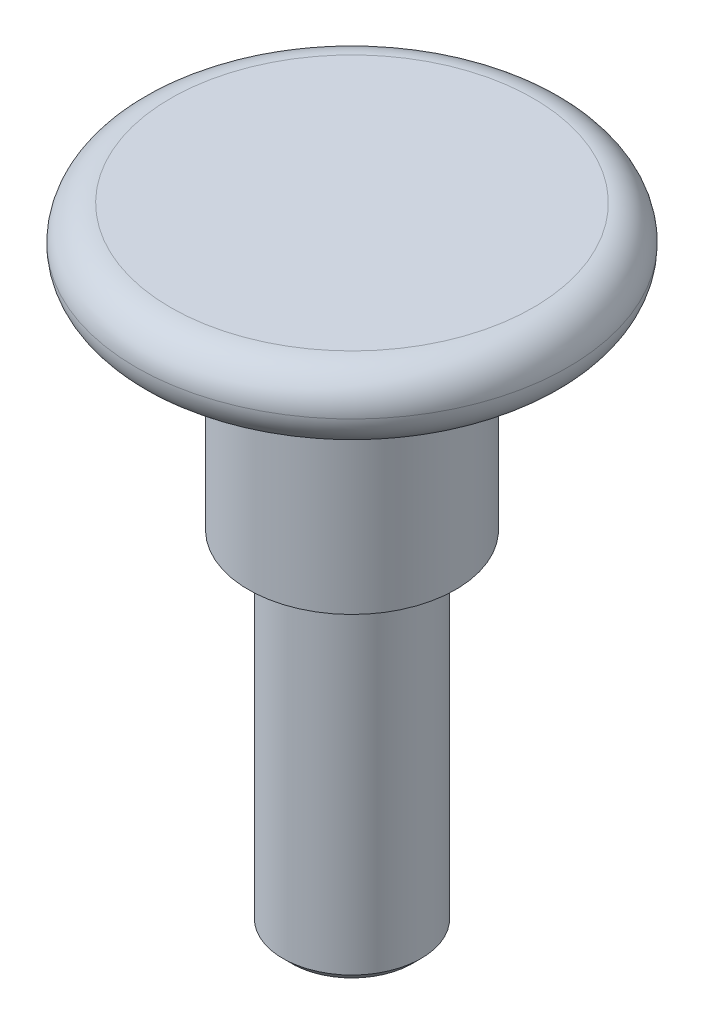
ISO-10303-21;
HEADER;
FILE_DESCRIPTION(('STEP AP214'),'2;1');
FILE_NAME('part.step','',(''),(''),'','','');
FILE_SCHEMA(('AUTOMOTIVE_DESIGN { 1 0 10303 214 1 1 1 1 }'));
ENDSEC;
DATA;
#1=APPLICATION_CONTEXT('core data for automotive mechanical design processes');
#2=APPLICATION_PROTOCOL_DEFINITION('international standard','automotive_design',2000,#1);
#3=PRODUCT_CONTEXT('',#1,'mechanical');
#4=PRODUCT('Part','Part','',(#3));
#5=PRODUCT_RELATED_PRODUCT_CATEGORY('part','',(#4));
#6=PRODUCT_DEFINITION_FORMATION('','',#4);
#7=PRODUCT_DEFINITION_CONTEXT('part definition',#1,'design');
#8=PRODUCT_DEFINITION('design','',#6,#7);
#9=PRODUCT_DEFINITION_SHAPE('','',#8);
#10=(LENGTH_UNIT() NAMED_UNIT(*) SI_UNIT(.MILLI.,.METRE.));
#11=(NAMED_UNIT(*) PLANE_ANGLE_UNIT() SI_UNIT($,.RADIAN.));
#12=(NAMED_UNIT(*) SI_UNIT($,.STERADIAN.) SOLID_ANGLE_UNIT());
#13=UNCERTAINTY_MEASURE_WITH_UNIT(LENGTH_MEASURE(1.E-05),#10,'distance_accuracy_value','');
#14=(GEOMETRIC_REPRESENTATION_CONTEXT(3) GLOBAL_UNCERTAINTY_ASSIGNED_CONTEXT((#13)) GLOBAL_UNIT_ASSIGNED_CONTEXT((#10,
#11,#12)) REPRESENTATION_CONTEXT('',''));
#15=CARTESIAN_POINT('',(0.,0.,0.));
#16=DIRECTION('',(0.,0.,1.));
#17=DIRECTION('',(1.,0.,0.));
#18=AXIS2_PLACEMENT_3D('',#15,#16,#17);
#19=CARTESIAN_POINT('',(0.,58.9361572535991,0.));
#20=DIRECTION('',(0.,1.,0.));
#21=DIRECTION('',(0.,0.,1.));
#22=AXIS2_PLACEMENT_3D('',#19,#20,#21);
#23=PLANE('',#22);
#24=CARTESIAN_POINT('',(0.,58.9361572535991,0.));
#25=DIRECTION('',(0.,1.,0.));
#26=DIRECTION('',(0.,0.,1.));
#27=AXIS2_PLACEMENT_3D('',#24,#25,#26);
#28=CIRCLE('',#27,10.5);
#29=CARTESIAN_POINT('',(0.,58.9361572535991,10.5));
#30=VERTEX_POINT('',#29);
#31=EDGE_CURVE('E85',#30,#30,#28,.T.);
#32=ORIENTED_EDGE('',*,*,#31,.T.);
#33=EDGE_LOOP('',(#32));
#34=FACE_BOUND('',#33,.T.);
#35=ADVANCED_FACE('F33',(#34),#23,.T.);
#36=CARTESIAN_POINT('',(12.5,54.9361572535991,0.));
#37=DIRECTION('',(0.,-1.,0.));
#38=DIRECTION('',(0.,0.,-1.));
#39=AXIS2_PLACEMENT_3D('',#36,#37,#38);
#40=PLANE('',#39);
#41=CARTESIAN_POINT('',(0.,54.9361572535991,0.));
#42=DIRECTION('',(0.,-1.,0.));
#43=DIRECTION('',(0.,0.,-1.));
#44=AXIS2_PLACEMENT_3D('',#41,#42,#43);
#45=CIRCLE('',#44,10.5);
#46=CARTESIAN_POINT('',(0.,54.9361572535991,-10.5));
#47=VERTEX_POINT('',#46);
#48=EDGE_CURVE('E84',#47,#47,#45,.T.);
#49=ORIENTED_EDGE('',*,*,#48,.T.);
#50=EDGE_LOOP('',(#49));
#51=FACE_BOUND('',#50,.T.);
#52=CARTESIAN_POINT('',(0.,54.9361572535991,0.));
#53=DIRECTION('',(0.,-1.,0.));
#54=DIRECTION('',(0.,0.,-1.));
#55=AXIS2_PLACEMENT_3D('',#52,#53,#54);
#56=CIRCLE('',#55,6.);
#57=CARTESIAN_POINT('',(0.,54.9361572535991,-6.));
#58=VERTEX_POINT('',#57);
#59=EDGE_CURVE('E86',#58,#58,#56,.T.);
#60=ORIENTED_EDGE('',*,*,#59,.F.);
#61=EDGE_LOOP('',(#60));
#62=FACE_BOUND('',#61,.T.);
#63=ADVANCED_FACE('F60',(#51,#62),#40,.T.);
#64=CARTESIAN_POINT('',(0.,-51.5243078626799,0.));
#65=DIRECTION('',(0.,-1.,0.));
#66=DIRECTION('',(0.,0.,-1.));
#67=AXIS2_PLACEMENT_3D('',#64,#65,#66);
#68=CYLINDRICAL_SURFACE('',#67,6.);
#69=ORIENTED_EDGE('',*,*,#59,.T.);
#70=EDGE_LOOP('',(#69));
#71=FACE_BOUND('',#70,.T.);
#72=CARTESIAN_POINT('',(0.,42.5361572535991,0.));
#73=DIRECTION('',(0.,-1.,0.));
#74=DIRECTION('',(0.,0.,-1.));
#75=AXIS2_PLACEMENT_3D('',#72,#73,#74);
#76=CIRCLE('',#75,6.);
#77=CARTESIAN_POINT('',(0.,42.5361572535991,-6.));
#78=VERTEX_POINT('',#77);
#79=EDGE_CURVE('E90',#78,#78,#76,.T.);
#80=ORIENTED_EDGE('',*,*,#79,.F.);
#81=EDGE_LOOP('',(#80));
#82=FACE_BOUND('',#81,.T.);
#83=ADVANCED_FACE('F66',(#71,#82),#68,.T.);
#84=CARTESIAN_POINT('',(6.,42.5361572535991,0.));
#85=DIRECTION('',(0.,-1.,0.));
#86=DIRECTION('',(0.,0.,-1.));
#87=AXIS2_PLACEMENT_3D('',#84,#85,#86);
#88=PLANE('',#87);
#89=ORIENTED_EDGE('',*,*,#79,.T.);
#90=EDGE_LOOP('',(#89));
#91=FACE_BOUND('',#90,.T.);
#92=CARTESIAN_POINT('',(0.,42.5361572535991,0.));
#93=DIRECTION('',(0.,-1.,0.));
#94=DIRECTION('',(0.,0.,-1.));
#95=AXIS2_PLACEMENT_3D('',#92,#93,#94);
#96=CIRCLE('',#95,4.);
#97=CARTESIAN_POINT('',(0.,42.5361572535991,-4.));
#98=VERTEX_POINT('',#97);
#99=EDGE_CURVE('E106',#98,#98,#96,.T.);
#100=ORIENTED_EDGE('',*,*,#99,.F.);
#101=EDGE_LOOP('',(#100));
#102=FACE_BOUND('',#101,.T.);
#103=ADVANCED_FACE('F114',(#91,#102),#88,.T.);
#104=CARTESIAN_POINT('',(0.,-51.5243078626799,0.));
#105=DIRECTION('',(0.,-1.,0.));
#106=DIRECTION('',(0.,0.,-1.));
#107=AXIS2_PLACEMENT_3D('',#104,#105,#106);
#108=CYLINDRICAL_SURFACE('',#107,4.);
#109=CARTESIAN_POINT('',(0.,23.0361572535991,0.));
#110=DIRECTION('',(0.,-1.,0.));
#111=DIRECTION('',(0.,0.,-1.));
#112=AXIS2_PLACEMENT_3D('',#109,#110,#111);
#113=CIRCLE('',#112,4.);
#114=CARTESIAN_POINT('',(0.,23.0361572535991,-4.));
#115=VERTEX_POINT('',#114);
#116=EDGE_CURVE('E11',#115,#115,#113,.F.);
#117=ORIENTED_EDGE('',*,*,#116,.T.);
#118=EDGE_LOOP('',(#117));
#119=FACE_BOUND('',#118,.T.);
#120=ORIENTED_EDGE('',*,*,#99,.T.);
#121=EDGE_LOOP('',(#120));
#122=FACE_BOUND('',#121,.T.);
#123=ADVANCED_FACE('F101',(#119,#122),#108,.T.);
#124=CARTESIAN_POINT('',(4.,22.5361572535991,0.));
#125=DIRECTION('',(0.,-1.,0.));
#126=DIRECTION('',(0.,0.,-1.));
#127=AXIS2_PLACEMENT_3D('',#124,#125,#126);
#128=PLANE('',#127);
#129=CARTESIAN_POINT('',(0.,22.5361572535991,0.));
#130=DIRECTION('',(0.,-1.,0.));
#131=DIRECTION('',(0.,0.,-1.));
#132=AXIS2_PLACEMENT_3D('',#129,#130,#131);
#133=CIRCLE('',#132,3.5);
#134=CARTESIAN_POINT('',(0.,22.5361572535991,-3.5));
#135=VERTEX_POINT('',#134);
#136=EDGE_CURVE('E40',#135,#135,#133,.T.);
#137=ORIENTED_EDGE('',*,*,#136,.T.);
#138=EDGE_LOOP('',(#137));
#139=FACE_BOUND('',#138,.T.);
#140=CARTESIAN_POINT('',(0.,22.5361572535991,0.));
#141=DIRECTION('',(0.,-1.,0.));
#142=DIRECTION('',(0.,0.,-1.));
#143=AXIS2_PLACEMENT_3D('',#140,#141,#142);
#144=CIRCLE('',#143,1.75000000000001);
#145=CARTESIAN_POINT('',(0.,22.5361572535991,-1.75000000000001));
#146=VERTEX_POINT('',#145);
#147=EDGE_CURVE('E105',#146,#146,#144,.T.);
#148=ORIENTED_EDGE('',*,*,#147,.F.);
#149=EDGE_LOOP('',(#148));
#150=FACE_BOUND('',#149,.T.);
#151=ADVANCED_FACE('F55',(#139,#150),#128,.T.);
#152=CARTESIAN_POINT('',(0.,-51.5243078626799,0.));
#153=DIRECTION('',(0.,-1.,0.));
#154=DIRECTION('',(0.,0.,-1.));
#155=AXIS2_PLACEMENT_3D('',#152,#153,#154);
#156=CYLINDRICAL_SURFACE('',#155,1.75000000000001);
#157=ORIENTED_EDGE('',*,*,#147,.T.);
#158=EDGE_LOOP('',(#157));
#159=FACE_BOUND('',#158,.T.);
#160=CARTESIAN_POINT('',(0.,30.5361572535991,0.));
#161=DIRECTION('',(0.,-1.,0.));
#162=DIRECTION('',(0.,0.,-1.));
#163=AXIS2_PLACEMENT_3D('',#160,#161,#162);
#164=CIRCLE('',#163,1.75000000000001);
#165=CARTESIAN_POINT('',(0.,30.5361572535991,-1.75000000000001));
#166=VERTEX_POINT('',#165);
#167=EDGE_CURVE('E94',#166,#166,#164,.T.);
#168=ORIENTED_EDGE('',*,*,#167,.F.);
#169=EDGE_LOOP('',(#168));
#170=FACE_BOUND('',#169,.T.);
#171=ADVANCED_FACE('F46',(#159,#170),#156,.F.);
#172=CARTESIAN_POINT('',(0.,31.7861572535991,0.));
#173=DIRECTION('',(0.,-1.,0.));
#174=DIRECTION('',(0.,0.,-1.));
#175=AXIS2_PLACEMENT_3D('',#172,#173,#174);
#176=CONICAL_SURFACE('',#175,0.,0.950546840812083);
#177=ORIENTED_EDGE('',*,*,#167,.T.);
#178=EDGE_LOOP('',(#177));
#179=FACE_BOUND('',#178,.T.);
#180=CARTESIAN_POINT('',(0.,31.7861572535991,0.));
#181=VERTEX_POINT('',#180);
#182=VERTEX_LOOP('',#181);
#183=FACE_BOUND('',#182,.T.);
#184=ADVANCED_FACE('F43',(#179,#183),#176,.F.);
#185=CARTESIAN_POINT('',(0.,56.9361572535991,0.));
#186=DIRECTION('',(0.,1.,0.));
#187=DIRECTION('',(0.,0.,1.));
#188=AXIS2_PLACEMENT_3D('',#185,#186,#187);
#189=TOROIDAL_SURFACE('',#188,10.5,2.);
#190=ORIENTED_EDGE('',*,*,#31,.F.);
#191=EDGE_LOOP('',(#190));
#192=FACE_BOUND('',#191,.T.);
#193=CARTESIAN_POINT('',(0.,56.9361572535991,0.));
#194=DIRECTION('',(0.,1.,0.));
#195=DIRECTION('',(0.,0.,1.));
#196=AXIS2_PLACEMENT_3D('',#193,#194,#195);
#197=CIRCLE('',#196,12.5);
#198=CARTESIAN_POINT('',(0.,56.9361572535991,12.5));
#199=VERTEX_POINT('',#198);
#200=EDGE_CURVE('E81',#199,#199,#197,.F.);
#201=ORIENTED_EDGE('',*,*,#200,.F.);
#202=EDGE_LOOP('',(#201));
#203=FACE_BOUND('',#202,.T.);
#204=ADVANCED_FACE('F45',(#192,#203),#189,.T.);
#205=CARTESIAN_POINT('',(0.,56.9361572535991,0.));
#206=DIRECTION('',(0.,-1.,0.));
#207=DIRECTION('',(0.,0.,-1.));
#208=AXIS2_PLACEMENT_3D('',#205,#206,#207);
#209=TOROIDAL_SURFACE('',#208,10.5,2.);
#210=ORIENTED_EDGE('',*,*,#200,.T.);
#211=EDGE_LOOP('',(#210));
#212=FACE_BOUND('',#211,.T.);
#213=ORIENTED_EDGE('',*,*,#48,.F.);
#214=EDGE_LOOP('',(#213));
#215=FACE_BOUND('',#214,.T.);
#216=ADVANCED_FACE('F53',(#212,#215),#209,.T.);
#217=CARTESIAN_POINT('',(0.,22.5361572535991,0.));
#218=DIRECTION('',(0.,1.,0.));
#219=DIRECTION('',(0.,0.,1.));
#220=AXIS2_PLACEMENT_3D('',#217,#218,#219);
#221=CONICAL_SURFACE('',#220,3.5,0.785398163397445);
#222=ORIENTED_EDGE('',*,*,#116,.F.);
#223=EDGE_LOOP('',(#222));
#224=FACE_BOUND('',#223,.T.);
#225=ORIENTED_EDGE('',*,*,#136,.F.);
#226=EDGE_LOOP('',(#225));
#227=FACE_BOUND('',#226,.T.);
#228=ADVANCED_FACE('F35',(#224,#227),#221,.T.);
#229=CLOSED_SHELL('',(#35,#63,#83,#103,#123,#151,#171,#184,#204,#216,#228));
#230=MANIFOLD_SOLID_BREP('B2',#229);
#231=ADVANCED_BREP_SHAPE_REPRESENTATION('',(#18,#230),#14);
#232=SHAPE_DEFINITION_REPRESENTATION(#9,#231);
ENDSEC;
END-ISO-10303-21;
